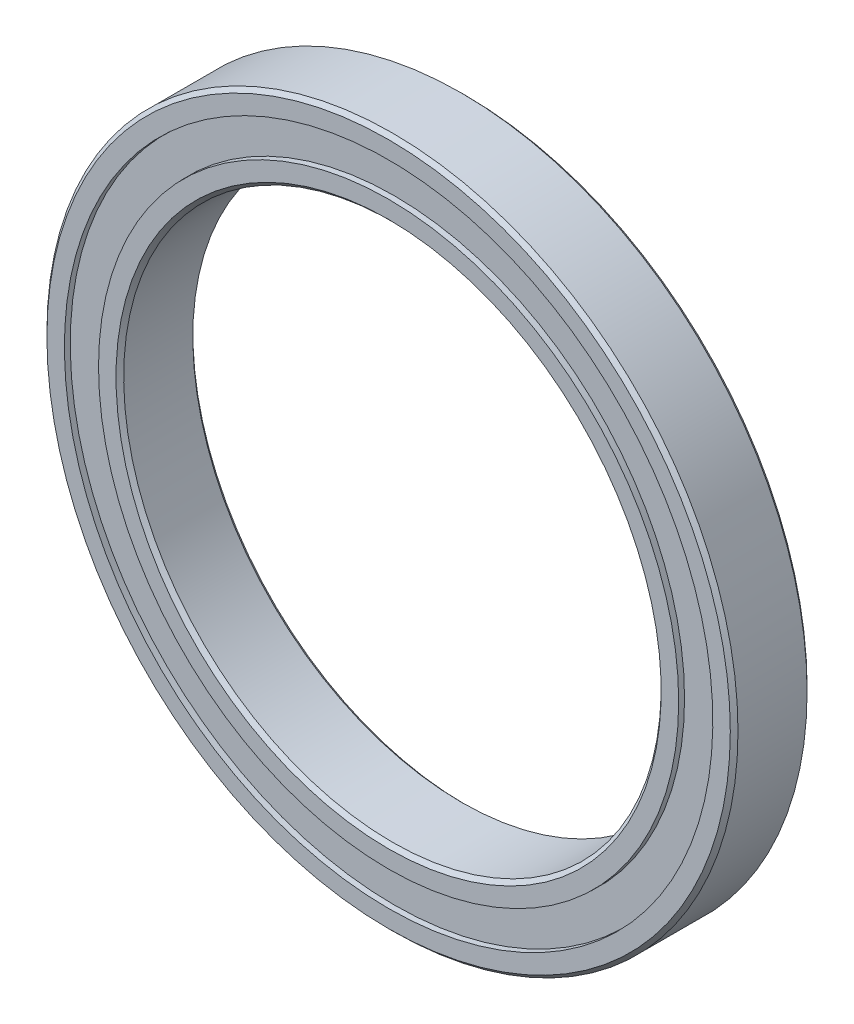
ISO-10303-21;
HEADER;
FILE_DESCRIPTION(('STEP AP214'),'2;1');
FILE_NAME('part.step','',(''),(''),'','','');
FILE_SCHEMA(('AUTOMOTIVE_DESIGN { 1 0 10303 214 1 1 1 1 }'));
ENDSEC;
DATA;
#1=APPLICATION_CONTEXT('core data for automotive mechanical design processes');
#2=APPLICATION_PROTOCOL_DEFINITION('international standard','automotive_design',2000,#1);
#3=PRODUCT_CONTEXT('',#1,'mechanical');
#4=PRODUCT('Part','Part','',(#3));
#5=PRODUCT_RELATED_PRODUCT_CATEGORY('part','',(#4));
#6=PRODUCT_DEFINITION_FORMATION('','',#4);
#7=PRODUCT_DEFINITION_CONTEXT('part definition',#1,'design');
#8=PRODUCT_DEFINITION('design','',#6,#7);
#9=PRODUCT_DEFINITION_SHAPE('','',#8);
#10=(LENGTH_UNIT() NAMED_UNIT(*) SI_UNIT(.MILLI.,.METRE.));
#11=(NAMED_UNIT(*) PLANE_ANGLE_UNIT() SI_UNIT($,.RADIAN.));
#12=(NAMED_UNIT(*) SI_UNIT($,.STERADIAN.) SOLID_ANGLE_UNIT());
#13=UNCERTAINTY_MEASURE_WITH_UNIT(LENGTH_MEASURE(1.E-05),#10,'distance_accuracy_value','');
#14=(GEOMETRIC_REPRESENTATION_CONTEXT(3) GLOBAL_UNCERTAINTY_ASSIGNED_CONTEXT((#13)) GLOBAL_UNIT_ASSIGNED_CONTEXT((#10,
#11,#12)) REPRESENTATION_CONTEXT('',''));
#15=CARTESIAN_POINT('',(0.,0.,0.));
#16=DIRECTION('',(0.,0.,1.));
#17=DIRECTION('',(1.,0.,0.));
#18=AXIS2_PLACEMENT_3D('',#15,#16,#17);
#19=CARTESIAN_POINT('',(10.3527618041003,38.6370330515629,0.));
#20=DIRECTION('',(0.,0.,1.));
#21=DIRECTION('',(0.258819045102508,0.965925826289072,0.));
#22=AXIS2_PLACEMENT_3D('',#19,#20,#21);
#23=SPHERICAL_SURFACE('',#22,3.14269680527354);
#24=CARTESIAN_POINT('',(10.3527618041003,38.6370330515629,3.14269680527354));
#25=VERTEX_POINT('',#24);
#26=VERTEX_LOOP('',#25);
#27=FACE_BOUND('',#26,.T.);
#28=ADVANCED_FACE('F46',(#27),#23,.T.);
#29=CLOSED_SHELL('',(#28));
#30=MANIFOLD_SOLID_BREP('B2',#29);
#31=CARTESIAN_POINT('',(19.9999999999996,34.6410161513778,0.));
#32=DIRECTION('',(0.,0.,1.));
#33=DIRECTION('',(0.499999999999989,0.866025403784445,0.));
#34=AXIS2_PLACEMENT_3D('',#31,#32,#33);
#35=SPHERICAL_SURFACE('',#34,3.14269680527354);
#36=CARTESIAN_POINT('',(19.9999999999996,34.6410161513778,3.14269680527354));
#37=VERTEX_POINT('',#36);
#38=VERTEX_LOOP('',#37);
#39=FACE_BOUND('',#38,.T.);
#40=ADVANCED_FACE('F63',(#39),#35,.T.);
#41=CLOSED_SHELL('',(#40));
#42=MANIFOLD_SOLID_BREP('B6',#41);
#43=CARTESIAN_POINT('',(28.2842712474616,28.2842712474623,0.));
#44=DIRECTION('',(0.,0.,1.));
#45=DIRECTION('',(0.707106781186539,0.707106781186556,0.));
#46=AXIS2_PLACEMENT_3D('',#43,#44,#45);
#47=SPHERICAL_SURFACE('',#46,3.14269680527354);
#48=CARTESIAN_POINT('',(28.2842712474616,28.2842712474623,3.14269680527354));
#49=VERTEX_POINT('',#48);
#50=VERTEX_LOOP('',#49);
#51=FACE_BOUND('',#50,.T.);
#52=ADVANCED_FACE('F81',(#51),#47,.T.);
#53=CLOSED_SHELL('',(#52));
#54=MANIFOLD_SOLID_BREP('B45',#53);
#55=CARTESIAN_POINT('',(34.6410161513773,20.0000000000004,0.));
#56=DIRECTION('',(0.,0.,1.));
#57=DIRECTION('',(0.866025403784433,0.50000000000001,0.));
#58=AXIS2_PLACEMENT_3D('',#55,#56,#57);
#59=SPHERICAL_SURFACE('',#58,3.14269680527354);
#60=CARTESIAN_POINT('',(34.6410161513773,20.0000000000004,3.14269680527354));
#61=VERTEX_POINT('',#60);
#62=VERTEX_LOOP('',#61);
#63=FACE_BOUND('',#62,.T.);
#64=ADVANCED_FACE('F101',(#63),#59,.T.);
#65=CLOSED_SHELL('',(#64));
#66=MANIFOLD_SOLID_BREP('B62',#65);
#67=CARTESIAN_POINT('',(38.6370330515626,10.3527618041013,0.));
#68=DIRECTION('',(0.,0.,1.));
#69=DIRECTION('',(0.965925826289065,0.258819045102531,0.));
#70=AXIS2_PLACEMENT_3D('',#67,#68,#69);
#71=SPHERICAL_SURFACE('',#70,3.14269680527354);
#72=CARTESIAN_POINT('',(38.6370330515626,10.3527618041013,3.14269680527354));
#73=VERTEX_POINT('',#72);
#74=VERTEX_LOOP('',#73);
#75=FACE_BOUND('',#74,.T.);
#76=ADVANCED_FACE('F125',(#75),#71,.T.);
#77=CLOSED_SHELL('',(#76));
#78=MANIFOLD_SOLID_BREP('B78',#77);
#79=CARTESIAN_POINT('',(40.,4.18977760661176E-13,0.));
#80=DIRECTION('',(0.,0.,1.));
#81=DIRECTION('',(1.,0.,0.));
#82=AXIS2_PLACEMENT_3D('',#79,#80,#81);
#83=SPHERICAL_SURFACE('',#82,3.14269680527354);
#84=CARTESIAN_POINT('',(40.,4.18592891302849E-13,3.14269680527354));
#85=VERTEX_POINT('',#84);
#86=VERTEX_LOOP('',#85);
#87=FACE_BOUND('',#86,.T.);
#88=ADVANCED_FACE('F142',(#87),#83,.T.);
#89=CLOSED_SHELL('',(#88));
#90=MANIFOLD_SOLID_BREP('B100',#89);
#91=CARTESIAN_POINT('',(38.6370330515628,-10.3527618041004,0.));
#92=DIRECTION('',(0.,0.,1.));
#93=DIRECTION('',(0.965925826289071,-0.258819045102511,0.));
#94=AXIS2_PLACEMENT_3D('',#91,#92,#93);
#95=SPHERICAL_SURFACE('',#94,3.14269680527354);
#96=CARTESIAN_POINT('',(38.6370330515628,-10.3527618041004,3.14269680527354));
#97=VERTEX_POINT('',#96);
#98=VERTEX_LOOP('',#97);
#99=FACE_BOUND('',#98,.T.);
#100=ADVANCED_FACE('F158',(#99),#95,.T.);
#101=CLOSED_SHELL('',(#100));
#102=MANIFOLD_SOLID_BREP('B117',#101);
#103=CARTESIAN_POINT('',(34.6410161513777,-19.9999999999997,0.));
#104=DIRECTION('',(0.,0.,1.));
#105=DIRECTION('',(0.866025403784443,-0.499999999999992,0.));
#106=AXIS2_PLACEMENT_3D('',#103,#104,#105);
#107=SPHERICAL_SURFACE('',#106,3.14269680527354);
#108=CARTESIAN_POINT('',(34.6410161513777,-19.9999999999997,3.14269680527354));
#109=VERTEX_POINT('',#108);
#110=VERTEX_LOOP('',#109);
#111=FACE_BOUND('',#110,.T.);
#112=ADVANCED_FACE('F181',(#111),#107,.T.);
#113=CLOSED_SHELL('',(#112));
#114=MANIFOLD_SOLID_BREP('B140',#113);
#115=CARTESIAN_POINT('',(28.2842712474622,-28.2842712474617,0.));
#116=DIRECTION('',(0.,0.,1.));
#117=DIRECTION('',(0.707106781186554,-0.707106781186541,0.));
#118=AXIS2_PLACEMENT_3D('',#115,#116,#117);
#119=SPHERICAL_SURFACE('',#118,3.14269680527354);
#120=CARTESIAN_POINT('',(28.2842712474622,-28.2842712474617,3.14269680527353));
#121=VERTEX_POINT('',#120);
#122=VERTEX_LOOP('',#121);
#123=FACE_BOUND('',#122,.T.);
#124=ADVANCED_FACE('F205',(#123),#119,.T.);
#125=CLOSED_SHELL('',(#124));
#126=MANIFOLD_SOLID_BREP('B157',#125);
#127=CARTESIAN_POINT('',(20.0000000000003,-34.6410161513774,0.));
#128=DIRECTION('',(0.,0.,1.));
#129=DIRECTION('',(0.500000000000007,-0.866025403784435,0.));
#130=AXIS2_PLACEMENT_3D('',#127,#128,#129);
#131=SPHERICAL_SURFACE('',#130,3.14269680527354);
#132=CARTESIAN_POINT('',(20.0000000000003,-34.6410161513774,3.14269680527353));
#133=VERTEX_POINT('',#132);
#134=VERTEX_LOOP('',#133);
#135=FACE_BOUND('',#134,.T.);
#136=ADVANCED_FACE('F225',(#135),#131,.T.);
#137=CLOSED_SHELL('',(#136));
#138=MANIFOLD_SOLID_BREP('B180',#137);
#139=CARTESIAN_POINT('',(10.3527618041011,-38.6370330515627,0.));
#140=DIRECTION('',(0.,0.,1.));
#141=DIRECTION('',(0.258819045102528,-0.965925826289066,0.));
#142=AXIS2_PLACEMENT_3D('',#139,#140,#141);
#143=SPHERICAL_SURFACE('',#142,3.14269680527354);
#144=CARTESIAN_POINT('',(10.3527618041011,-38.6370330515627,3.14269680527353));
#145=VERTEX_POINT('',#144);
#146=VERTEX_LOOP('',#145);
#147=FACE_BOUND('',#146,.T.);
#148=ADVANCED_FACE('F242',(#147),#143,.T.);
#149=CLOSED_SHELL('',(#148));
#150=MANIFOLD_SOLID_BREP('B197',#149);
#151=CARTESIAN_POINT('',(2.79318507107451E-13,-40.,0.));
#152=DIRECTION('',(0.,0.,1.));
#153=DIRECTION('',(0.,-1.,0.));
#154=AXIS2_PLACEMENT_3D('',#151,#152,#153);
#155=SPHERICAL_SURFACE('',#154,3.14269680527354);
#156=CARTESIAN_POINT('',(2.79318507107451E-13,-40.,3.14269680527353));
#157=VERTEX_POINT('',#156);
#158=VERTEX_LOOP('',#157);
#159=FACE_BOUND('',#158,.T.);
#160=ADVANCED_FACE('F261',(#159),#155,.T.);
#161=CLOSED_SHELL('',(#160));
#162=MANIFOLD_SOLID_BREP('B220',#161);
#163=CARTESIAN_POINT('',(-10.3527618041006,-38.6370330515628,0.));
#164=DIRECTION('',(0.,0.,1.));
#165=DIRECTION('',(-0.258819045102515,-0.96592582628907,0.));
#166=AXIS2_PLACEMENT_3D('',#163,#164,#165);
#167=SPHERICAL_SURFACE('',#166,3.14269680527354);
#168=CARTESIAN_POINT('',(-10.3527618041006,-38.6370330515628,3.14269680527353));
#169=VERTEX_POINT('',#168);
#170=VERTEX_LOOP('',#169);
#171=FACE_BOUND('',#170,.T.);
#172=ADVANCED_FACE('F287',(#171),#167,.T.);
#173=CLOSED_SHELL('',(#172));
#174=MANIFOLD_SOLID_BREP('B239',#173);
#175=CARTESIAN_POINT('',(-19.9999999999998,-34.6410161513777,0.));
#176=DIRECTION('',(0.,0.,1.));
#177=DIRECTION('',(-0.499999999999995,-0.866025403784442,0.));
#178=AXIS2_PLACEMENT_3D('',#175,#176,#177);
#179=SPHERICAL_SURFACE('',#178,3.14269680527354);
#180=CARTESIAN_POINT('',(-19.9999999999998,-34.6410161513777,3.14269680527353));
#181=VERTEX_POINT('',#180);
#182=VERTEX_LOOP('',#181);
#183=FACE_BOUND('',#182,.T.);
#184=ADVANCED_FACE('F310',(#183),#179,.T.);
#185=CLOSED_SHELL('',(#184));
#186=MANIFOLD_SOLID_BREP('B263',#185);
#187=CARTESIAN_POINT('',(-28.2842712474618,-28.2842712474621,0.));
#188=DIRECTION('',(0.,0.,1.));
#189=DIRECTION('',(-0.707106781186544,-0.707106781186551,0.));
#190=AXIS2_PLACEMENT_3D('',#187,#188,#189);
#191=SPHERICAL_SURFACE('',#190,3.14269680527354);
#192=CARTESIAN_POINT('',(-28.2842712474618,-28.2842712474621,3.14269680527353));
#193=VERTEX_POINT('',#192);
#194=VERTEX_LOOP('',#193);
#195=FACE_BOUND('',#194,.T.);
#196=ADVANCED_FACE('F327',(#195),#191,.T.);
#197=CLOSED_SHELL('',(#196));
#198=MANIFOLD_SOLID_BREP('B284',#197);
#199=CARTESIAN_POINT('',(-34.6410161513775,-20.0000000000002,0.));
#200=DIRECTION('',(0.,0.,1.));
#201=DIRECTION('',(-0.866025403784436,-0.500000000000004,0.));
#202=AXIS2_PLACEMENT_3D('',#199,#200,#201);
#203=SPHERICAL_SURFACE('',#202,3.14269680527354);
#204=CARTESIAN_POINT('',(-34.6410161513775,-20.0000000000002,3.14269680527354));
#205=VERTEX_POINT('',#204);
#206=VERTEX_LOOP('',#205);
#207=FACE_BOUND('',#206,.T.);
#208=ADVANCED_FACE('F350',(#207),#203,.T.);
#209=CLOSED_SHELL('',(#208));
#210=MANIFOLD_SOLID_BREP('B303',#209);
#211=CARTESIAN_POINT('',(-38.6370330515627,-10.352761804101,0.));
#212=DIRECTION('',(0.,0.,1.));
#213=DIRECTION('',(-0.965925826289067,-0.258819045102525,0.));
#214=AXIS2_PLACEMENT_3D('',#211,#212,#213);
#215=SPHERICAL_SURFACE('',#214,3.14269680527354);
#216=CARTESIAN_POINT('',(-38.6370330515627,-10.352761804101,3.14269680527354));
#217=VERTEX_POINT('',#216);
#218=VERTEX_LOOP('',#217);
#219=FACE_BOUND('',#218,.T.);
#220=ADVANCED_FACE('F369',(#219),#215,.T.);
#221=CLOSED_SHELL('',(#220));
#222=MANIFOLD_SOLID_BREP('B321',#221);
#223=CARTESIAN_POINT('',(-40.,-1.39659253553725E-13,0.));
#224=DIRECTION('',(0.,0.,1.));
#225=DIRECTION('',(-1.,0.,0.));
#226=AXIS2_PLACEMENT_3D('',#223,#224,#225);
#227=SPHERICAL_SURFACE('',#226,3.14269680527354);
#228=CARTESIAN_POINT('',(-40.,-1.40044122912052E-13,3.14269680527354));
#229=VERTEX_POINT('',#228);
#230=VERTEX_LOOP('',#229);
#231=FACE_BOUND('',#230,.T.);
#232=ADVANCED_FACE('F393',(#231),#227,.T.);
#233=CLOSED_SHELL('',(#232));
#234=MANIFOLD_SOLID_BREP('B343',#233);
#235=CARTESIAN_POINT('',(-38.6370330515628,10.3527618041007,0.));
#236=DIRECTION('',(0.,0.,1.));
#237=DIRECTION('',(-0.965925826289069,0.258819045102518,0.));
#238=AXIS2_PLACEMENT_3D('',#235,#236,#237);
#239=SPHERICAL_SURFACE('',#238,3.14269680527354);
#240=CARTESIAN_POINT('',(-38.6370330515628,10.3527618041007,3.14269680527354));
#241=VERTEX_POINT('',#240);
#242=VERTEX_LOOP('',#241);
#243=FACE_BOUND('',#242,.T.);
#244=ADVANCED_FACE('F414',(#243),#239,.T.);
#245=CLOSED_SHELL('',(#244));
#246=MANIFOLD_SOLID_BREP('B366',#245);
#247=CARTESIAN_POINT('',(-34.6410161513776,19.9999999999999,0.));
#248=DIRECTION('',(0.,0.,1.));
#249=DIRECTION('',(-0.86602540378444,0.499999999999998,0.));
#250=AXIS2_PLACEMENT_3D('',#247,#248,#249);
#251=SPHERICAL_SURFACE('',#250,3.14269680527354);
#252=CARTESIAN_POINT('',(-34.6410161513776,19.9999999999999,3.14269680527354));
#253=VERTEX_POINT('',#252);
#254=VERTEX_LOOP('',#253);
#255=FACE_BOUND('',#254,.T.);
#256=ADVANCED_FACE('F433',(#255),#251,.T.);
#257=CLOSED_SHELL('',(#256));
#258=MANIFOLD_SOLID_BREP('B390',#257);
#259=CARTESIAN_POINT('',(-28.284271247462,28.2842712474619,0.));
#260=DIRECTION('',(0.,0.,1.));
#261=DIRECTION('',(-0.707106781186549,0.707106781186546,0.));
#262=AXIS2_PLACEMENT_3D('',#259,#260,#261);
#263=SPHERICAL_SURFACE('',#262,3.14269680527354);
#264=CARTESIAN_POINT('',(-28.284271247462,28.2842712474619,3.14269680527354));
#265=VERTEX_POINT('',#264);
#266=VERTEX_LOOP('',#265);
#267=FACE_BOUND('',#266,.T.);
#268=ADVANCED_FACE('F451',(#267),#263,.T.);
#269=CLOSED_SHELL('',(#268));
#270=MANIFOLD_SOLID_BREP('B409',#269);
#271=CARTESIAN_POINT('',(-20.,34.6410161513775,0.));
#272=DIRECTION('',(0.,0.,1.));
#273=DIRECTION('',(-0.500000000000001,0.866025403784438,0.));
#274=AXIS2_PLACEMENT_3D('',#271,#272,#273);
#275=SPHERICAL_SURFACE('',#274,3.14269680527354);
#276=CARTESIAN_POINT('',(-20.,34.6410161513775,3.14269680527354));
#277=VERTEX_POINT('',#276);
#278=VERTEX_LOOP('',#277);
#279=FACE_BOUND('',#278,.T.);
#280=ADVANCED_FACE('F473',(#279),#275,.T.);
#281=CLOSED_SHELL('',(#280));
#282=MANIFOLD_SOLID_BREP('B429',#281);
#283=CARTESIAN_POINT('',(-10.3527618041009,38.6370330515627,0.));
#284=DIRECTION('',(0.,0.,1.));
#285=DIRECTION('',(-0.258819045102521,0.965925826289068,0.));
#286=AXIS2_PLACEMENT_3D('',#283,#284,#285);
#287=SPHERICAL_SURFACE('',#286,3.14269680527354);
#288=CARTESIAN_POINT('',(-10.3527618041009,38.6370330515627,3.14269680527354));
#289=VERTEX_POINT('',#288);
#290=VERTEX_LOOP('',#289);
#291=FACE_BOUND('',#290,.T.);
#292=ADVANCED_FACE('F496',(#291),#287,.T.);
#293=CLOSED_SHELL('',(#292));
#294=MANIFOLD_SOLID_BREP('B448',#293);
#295=CARTESIAN_POINT('',(0.,40.,0.));
#296=DIRECTION('',(0.,0.,1.));
#297=DIRECTION('',(0.,1.,0.));
#298=AXIS2_PLACEMENT_3D('',#295,#296,#297);
#299=SPHERICAL_SURFACE('',#298,3.14269680527354);
#300=CARTESIAN_POINT('',(0.,40.,3.14269680527354));
#301=VERTEX_POINT('',#300);
#302=VERTEX_LOOP('',#301);
#303=FACE_BOUND('',#302,.T.);
#304=ADVANCED_FACE('F516',(#303),#299,.T.);
#305=CLOSED_SHELL('',(#304));
#306=MANIFOLD_SOLID_BREP('B472',#305);
#307=CARTESIAN_POINT('',(0.,37.7777777777778,5.00000000000002));
#308=DIRECTION('',(0.,0.,-1.));
#309=DIRECTION('',(0.,1.,0.));
#310=AXIS2_PLACEMENT_3D('',#307,#308,#309);
#311=PLANE('',#310);
#312=CARTESIAN_POINT('',(0.,0.,5.00000000000002));
#313=DIRECTION('',(0.,0.,1.));
#314=DIRECTION('',(0.,-1.,0.));
#315=AXIS2_PLACEMENT_3D('',#312,#313,#314);
#316=CIRCLE('',#315,35.5);
#317=CARTESIAN_POINT('',(0.,-35.5,5.00000000000002));
#318=VERTEX_POINT('',#317);
#319=EDGE_CURVE('E580',#318,#318,#316,.T.);
#320=ORIENTED_EDGE('',*,*,#319,.F.);
#321=EDGE_LOOP('',(#320));
#322=FACE_BOUND('',#321,.T.);
#323=CARTESIAN_POINT('',(0.,0.,5.00000000000002));
#324=DIRECTION('',(0.,0.,1.));
#325=DIRECTION('',(0.,-1.,0.));
#326=AXIS2_PLACEMENT_3D('',#323,#324,#325);
#327=CIRCLE('',#326,37.7777777777778);
#328=CARTESIAN_POINT('',(0.,-37.7777777777778,5.00000000000002));
#329=VERTEX_POINT('',#328);
#330=EDGE_CURVE('E519',#329,#329,#327,.T.);
#331=ORIENTED_EDGE('',*,*,#330,.T.);
#332=EDGE_LOOP('',(#331));
#333=FACE_BOUND('',#332,.T.);
#334=ADVANCED_FACE('F538',(#322,#333),#311,.F.);
#335=CARTESIAN_POINT('',(0.,0.,5.00000000000002));
#336=DIRECTION('',(0.,0.,1.));
#337=DIRECTION('',(0.,-1.,0.));
#338=AXIS2_PLACEMENT_3D('',#335,#336,#337);
#339=CYLINDRICAL_SURFACE('',#338,37.7777777777778);
#340=ORIENTED_EDGE('',*,*,#330,.F.);
#341=EDGE_LOOP('',(#340));
#342=FACE_BOUND('',#341,.T.);
#343=CARTESIAN_POINT('',(0.,0.,2.22222222222222));
#344=DIRECTION('',(0.,0.,1.));
#345=DIRECTION('',(0.,-1.,0.));
#346=AXIS2_PLACEMENT_3D('',#343,#344,#345);
#347=CIRCLE('',#346,37.7777777777778);
#348=CARTESIAN_POINT('',(0.,-37.7777777777778,2.22222222222221));
#349=VERTEX_POINT('',#348);
#350=EDGE_CURVE('E549',#349,#349,#347,.T.);
#351=ORIENTED_EDGE('',*,*,#350,.T.);
#352=EDGE_LOOP('',(#351));
#353=FACE_BOUND('',#352,.T.);
#354=ADVANCED_FACE('F588',(#342,#353),#339,.T.);
#355=CARTESIAN_POINT('',(0.,0.,0.));
#356=DIRECTION('',(0.,0.,1.));
#357=DIRECTION('',(0.,-1.,0.));
#358=AXIS2_PLACEMENT_3D('',#355,#356,#357);
#359=TOROIDAL_SURFACE('',#358,40.,3.14269680527354);
#360=ORIENTED_EDGE('',*,*,#350,.F.);
#361=EDGE_LOOP('',(#360));
#362=FACE_BOUND('',#361,.T.);
#363=CARTESIAN_POINT('',(0.,0.,-2.22222222222223));
#364=DIRECTION('',(0.,0.,1.));
#365=DIRECTION('',(0.,-1.,0.));
#366=AXIS2_PLACEMENT_3D('',#363,#364,#365);
#367=CIRCLE('',#366,37.7777777777778);
#368=CARTESIAN_POINT('',(0.,-37.7777777777778,-2.22222222222223));
#369=VERTEX_POINT('',#368);
#370=EDGE_CURVE('E551',#369,#369,#367,.T.);
#371=ORIENTED_EDGE('',*,*,#370,.T.);
#372=EDGE_LOOP('',(#371));
#373=FACE_BOUND('',#372,.T.);
#374=ADVANCED_FACE('F586',(#362,#373),#359,.F.);
#375=CARTESIAN_POINT('',(0.,0.,5.00000000000002));
#376=DIRECTION('',(0.,0.,1.));
#377=DIRECTION('',(0.,-1.,0.));
#378=AXIS2_PLACEMENT_3D('',#375,#376,#377);
#379=CYLINDRICAL_SURFACE('',#378,37.7777777777778);
#380=ORIENTED_EDGE('',*,*,#370,.F.);
#381=EDGE_LOOP('',(#380));
#382=FACE_BOUND('',#381,.T.);
#383=CARTESIAN_POINT('',(0.,0.,-5.00000000000003));
#384=DIRECTION('',(0.,0.,1.));
#385=DIRECTION('',(0.,-1.,0.));
#386=AXIS2_PLACEMENT_3D('',#383,#384,#385);
#387=CIRCLE('',#386,37.7777777777778);
#388=CARTESIAN_POINT('',(0.,-37.7777777777778,-5.00000000000003));
#389=VERTEX_POINT('',#388);
#390=EDGE_CURVE('E559',#389,#389,#387,.T.);
#391=ORIENTED_EDGE('',*,*,#390,.T.);
#392=EDGE_LOOP('',(#391));
#393=FACE_BOUND('',#392,.T.);
#394=ADVANCED_FACE('F594',(#382,#393),#379,.T.);
#395=CARTESIAN_POINT('',(0.,35.5,-5.00000000000003));
#396=DIRECTION('',(0.,0.,1.));
#397=DIRECTION('',(0.,-1.,0.));
#398=AXIS2_PLACEMENT_3D('',#395,#396,#397);
#399=PLANE('',#398);
#400=ORIENTED_EDGE('',*,*,#390,.F.);
#401=EDGE_LOOP('',(#400));
#402=FACE_BOUND('',#401,.T.);
#403=CARTESIAN_POINT('',(0.,0.,-5.00000000000003));
#404=DIRECTION('',(0.,0.,1.));
#405=DIRECTION('',(0.,-1.,0.));
#406=AXIS2_PLACEMENT_3D('',#403,#404,#405);
#407=CIRCLE('',#406,35.5);
#408=CARTESIAN_POINT('',(0.,-35.5,-5.00000000000004));
#409=VERTEX_POINT('',#408);
#410=EDGE_CURVE('E564',#409,#409,#407,.T.);
#411=ORIENTED_EDGE('',*,*,#410,.T.);
#412=EDGE_LOOP('',(#411));
#413=FACE_BOUND('',#412,.T.);
#414=ADVANCED_FACE('F602',(#402,#413),#399,.F.);
#415=CARTESIAN_POINT('',(0.,0.,-4.50000000000002));
#416=DIRECTION('',(0.,0.,-1.));
#417=DIRECTION('',(0.,1.,0.));
#418=AXIS2_PLACEMENT_3D('',#415,#416,#417);
#419=CONICAL_SURFACE('',#418,35.,0.785398163397433);
#420=ORIENTED_EDGE('',*,*,#410,.F.);
#421=EDGE_LOOP('',(#420));
#422=FACE_BOUND('',#421,.T.);
#423=CARTESIAN_POINT('',(0.,0.,-4.50000000000002));
#424=DIRECTION('',(0.,0.,1.));
#425=DIRECTION('',(0.,-1.,0.));
#426=AXIS2_PLACEMENT_3D('',#423,#424,#425);
#427=CIRCLE('',#426,35.);
#428=CARTESIAN_POINT('',(0.,-35.,-4.50000000000003));
#429=VERTEX_POINT('',#428);
#430=EDGE_CURVE('E567',#429,#429,#427,.T.);
#431=ORIENTED_EDGE('',*,*,#430,.T.);
#432=EDGE_LOOP('',(#431));
#433=FACE_BOUND('',#432,.T.);
#434=ADVANCED_FACE('F603',(#422,#433),#419,.F.);
#435=CARTESIAN_POINT('',(0.,0.,5.00000000000002));
#436=DIRECTION('',(0.,0.,1.));
#437=DIRECTION('',(0.,-1.,0.));
#438=AXIS2_PLACEMENT_3D('',#435,#436,#437);
#439=CYLINDRICAL_SURFACE('',#438,35.);
#440=ORIENTED_EDGE('',*,*,#430,.F.);
#441=EDGE_LOOP('',(#440));
#442=FACE_BOUND('',#441,.T.);
#443=CARTESIAN_POINT('',(0.,0.,4.50000000000003));
#444=DIRECTION('',(0.,0.,1.));
#445=DIRECTION('',(0.,-1.,0.));
#446=AXIS2_PLACEMENT_3D('',#443,#444,#445);
#447=CIRCLE('',#446,35.);
#448=CARTESIAN_POINT('',(0.,-35.,4.50000000000002));
#449=VERTEX_POINT('',#448);
#450=EDGE_CURVE('E572',#449,#449,#447,.T.);
#451=ORIENTED_EDGE('',*,*,#450,.T.);
#452=EDGE_LOOP('',(#451));
#453=FACE_BOUND('',#452,.T.);
#454=ADVANCED_FACE('F610',(#442,#453),#439,.F.);
#455=CARTESIAN_POINT('',(0.,0.,5.00000000000002));
#456=DIRECTION('',(0.,0.,1.));
#457=DIRECTION('',(0.,-1.,0.));
#458=AXIS2_PLACEMENT_3D('',#455,#456,#457);
#459=CONICAL_SURFACE('',#458,35.5,0.785398163397463);
#460=ORIENTED_EDGE('',*,*,#450,.F.);
#461=EDGE_LOOP('',(#460));
#462=FACE_BOUND('',#461,.T.);
#463=ORIENTED_EDGE('',*,*,#319,.T.);
#464=EDGE_LOOP('',(#463));
#465=FACE_BOUND('',#464,.T.);
#466=ADVANCED_FACE('F584',(#462,#465),#459,.F.);
#467=CLOSED_SHELL('',(#334,#354,#374,#394,#414,#434,#454,#466));
#468=MANIFOLD_SOLID_BREP('B495',#467);
#469=CARTESIAN_POINT('',(0.,37.8031777777778,-3.88084840263679));
#470=DIRECTION('',(0.,0.,-1.));
#471=DIRECTION('',(0.,1.,0.));
#472=AXIS2_PLACEMENT_3D('',#469,#470,#471);
#473=PLANE('',#472);
#474=CARTESIAN_POINT('',(0.,0.,-3.88084840263679));
#475=DIRECTION('',(0.,0.,1.));
#476=DIRECTION('',(0.,-1.,0.));
#477=AXIS2_PLACEMENT_3D('',#474,#475,#476);
#478=CIRCLE('',#477,37.8031777777778);
#479=CARTESIAN_POINT('',(0.,-37.8031777777778,-3.8808484026368));
#480=VERTEX_POINT('',#479);
#481=EDGE_CURVE('E704',#480,#480,#478,.T.);
#482=ORIENTED_EDGE('',*,*,#481,.F.);
#483=EDGE_LOOP('',(#482));
#484=FACE_BOUND('',#483,.T.);
#485=CARTESIAN_POINT('',(0.,0.,-3.88084840263679));
#486=DIRECTION('',(0.,0.,1.));
#487=DIRECTION('',(0.,-1.,0.));
#488=AXIS2_PLACEMENT_3D('',#485,#486,#487);
#489=CIRCLE('',#488,42.1968222222222);
#490=CARTESIAN_POINT('',(0.,-42.1968222222222,-3.8808484026368));
#491=VERTEX_POINT('',#490);
#492=EDGE_CURVE('E536',#491,#491,#489,.T.);
#493=ORIENTED_EDGE('',*,*,#492,.T.);
#494=EDGE_LOOP('',(#493));
#495=FACE_BOUND('',#494,.T.);
#496=ADVANCED_FACE('F688',(#484,#495),#473,.F.);
#497=CARTESIAN_POINT('',(0.,0.,5.00000000000002));
#498=DIRECTION('',(0.,0.,1.));
#499=DIRECTION('',(0.,-1.,0.));
#500=AXIS2_PLACEMENT_3D('',#497,#498,#499);
#501=CYLINDRICAL_SURFACE('',#500,42.1968222222222);
#502=ORIENTED_EDGE('',*,*,#492,.F.);
#503=EDGE_LOOP('',(#502));
#504=FACE_BOUND('',#503,.T.);
#505=CARTESIAN_POINT('',(0.,0.,-4.26184840263679));
#506=DIRECTION('',(0.,0.,1.));
#507=DIRECTION('',(0.,-1.,0.));
#508=AXIS2_PLACEMENT_3D('',#505,#506,#507);
#509=CIRCLE('',#508,42.1968222222222);
#510=CARTESIAN_POINT('',(0.,-42.1968222222222,-4.2618484026368));
#511=VERTEX_POINT('',#510);
#512=EDGE_CURVE('E693',#511,#511,#509,.T.);
#513=ORIENTED_EDGE('',*,*,#512,.T.);
#514=EDGE_LOOP('',(#513));
#515=FACE_BOUND('',#514,.T.);
#516=ADVANCED_FACE('F718',(#504,#515),#501,.T.);
#517=CARTESIAN_POINT('',(0.,37.8031777777778,-4.26184840263679));
#518=DIRECTION('',(0.,0.,1.));
#519=DIRECTION('',(0.,-1.,0.));
#520=AXIS2_PLACEMENT_3D('',#517,#518,#519);
#521=PLANE('',#520);
#522=ORIENTED_EDGE('',*,*,#512,.F.);
#523=EDGE_LOOP('',(#522));
#524=FACE_BOUND('',#523,.T.);
#525=CARTESIAN_POINT('',(0.,0.,-4.26184840263679));
#526=DIRECTION('',(0.,0.,1.));
#527=DIRECTION('',(0.,-1.,0.));
#528=AXIS2_PLACEMENT_3D('',#525,#526,#527);
#529=CIRCLE('',#528,37.8031777777778);
#530=CARTESIAN_POINT('',(0.,-37.8031777777778,-4.2618484026368));
#531=VERTEX_POINT('',#530);
#532=EDGE_CURVE('E697',#531,#531,#529,.T.);
#533=ORIENTED_EDGE('',*,*,#532,.T.);
#534=EDGE_LOOP('',(#533));
#535=FACE_BOUND('',#534,.T.);
#536=ADVANCED_FACE('F716',(#524,#535),#521,.F.);
#537=CARTESIAN_POINT('',(0.,0.,5.00000000000002));
#538=DIRECTION('',(0.,0.,1.));
#539=DIRECTION('',(0.,-1.,0.));
#540=AXIS2_PLACEMENT_3D('',#537,#538,#539);
#541=CYLINDRICAL_SURFACE('',#540,37.8031777777778);
#542=ORIENTED_EDGE('',*,*,#532,.F.);
#543=EDGE_LOOP('',(#542));
#544=FACE_BOUND('',#543,.T.);
#545=ORIENTED_EDGE('',*,*,#481,.T.);
#546=EDGE_LOOP('',(#545));
#547=FACE_BOUND('',#546,.T.);
#548=ADVANCED_FACE('F714',(#544,#547),#541,.F.);
#549=CLOSED_SHELL('',(#496,#516,#536,#548));
#550=MANIFOLD_SOLID_BREP('B514',#549);
#551=CARTESIAN_POINT('',(0.,37.8031777777778,4.26184840263678));
#552=DIRECTION('',(0.,0.,-1.));
#553=DIRECTION('',(0.,1.,0.));
#554=AXIS2_PLACEMENT_3D('',#551,#552,#553);
#555=PLANE('',#554);
#556=CARTESIAN_POINT('',(0.,0.,4.26184840263678));
#557=DIRECTION('',(0.,0.,1.));
#558=DIRECTION('',(0.,-1.,0.));
#559=AXIS2_PLACEMENT_3D('',#556,#557,#558);
#560=CIRCLE('',#559,37.8031777777778);
#561=CARTESIAN_POINT('',(0.,-37.8031777777778,4.26184840263677));
#562=VERTEX_POINT('',#561);
#563=EDGE_CURVE('E684',#562,#562,#560,.T.);
#564=ORIENTED_EDGE('',*,*,#563,.F.);
#565=EDGE_LOOP('',(#564));
#566=FACE_BOUND('',#565,.T.);
#567=CARTESIAN_POINT('',(0.,0.,4.26184840263678));
#568=DIRECTION('',(0.,0.,1.));
#569=DIRECTION('',(0.,-1.,0.));
#570=AXIS2_PLACEMENT_3D('',#567,#568,#569);
#571=CIRCLE('',#570,42.1968222222222);
#572=CARTESIAN_POINT('',(0.,-42.1968222222222,4.26184840263677));
#573=VERTEX_POINT('',#572);
#574=EDGE_CURVE('E784',#573,#573,#571,.T.);
#575=ORIENTED_EDGE('',*,*,#574,.T.);
#576=EDGE_LOOP('',(#575));
#577=FACE_BOUND('',#576,.T.);
#578=ADVANCED_FACE('F763',(#566,#577),#555,.F.);
#579=CARTESIAN_POINT('',(0.,0.,5.00000000000002));
#580=DIRECTION('',(0.,0.,1.));
#581=DIRECTION('',(0.,-1.,0.));
#582=AXIS2_PLACEMENT_3D('',#579,#580,#581);
#583=CYLINDRICAL_SURFACE('',#582,37.8031777777778);
#584=CARTESIAN_POINT('',(0.,0.,3.88084840263678));
#585=DIRECTION('',(0.,0.,1.));
#586=DIRECTION('',(0.,-1.,0.));
#587=AXIS2_PLACEMENT_3D('',#584,#585,#586);
#588=CIRCLE('',#587,37.8031777777778);
#589=CARTESIAN_POINT('',(0.,-37.8031777777778,3.88084840263677));
#590=VERTEX_POINT('',#589);
#591=EDGE_CURVE('E769',#590,#590,#588,.T.);
#592=ORIENTED_EDGE('',*,*,#591,.F.);
#593=EDGE_LOOP('',(#592));
#594=FACE_BOUND('',#593,.T.);
#595=ORIENTED_EDGE('',*,*,#563,.T.);
#596=EDGE_LOOP('',(#595));
#597=FACE_BOUND('',#596,.T.);
#598=ADVANCED_FACE('F796',(#594,#597),#583,.F.);
#599=CARTESIAN_POINT('',(0.,37.8031777777778,3.88084840263678));
#600=DIRECTION('',(0.,0.,1.));
#601=DIRECTION('',(0.,-1.,0.));
#602=AXIS2_PLACEMENT_3D('',#599,#600,#601);
#603=PLANE('',#602);
#604=CARTESIAN_POINT('',(0.,0.,3.88084840263678));
#605=DIRECTION('',(0.,0.,1.));
#606=DIRECTION('',(0.,-1.,0.));
#607=AXIS2_PLACEMENT_3D('',#604,#605,#606);
#608=CIRCLE('',#607,42.1968222222222);
#609=CARTESIAN_POINT('',(0.,-42.1968222222222,3.88084840263677));
#610=VERTEX_POINT('',#609);
#611=EDGE_CURVE('E777',#610,#610,#608,.T.);
#612=ORIENTED_EDGE('',*,*,#611,.F.);
#613=EDGE_LOOP('',(#612));
#614=FACE_BOUND('',#613,.T.);
#615=ORIENTED_EDGE('',*,*,#591,.T.);
#616=EDGE_LOOP('',(#615));
#617=FACE_BOUND('',#616,.T.);
#618=ADVANCED_FACE('F794',(#614,#617),#603,.F.);
#619=CARTESIAN_POINT('',(0.,0.,5.00000000000002));
#620=DIRECTION('',(0.,0.,1.));
#621=DIRECTION('',(0.,-1.,0.));
#622=AXIS2_PLACEMENT_3D('',#619,#620,#621);
#623=CYLINDRICAL_SURFACE('',#622,42.1968222222222);
#624=ORIENTED_EDGE('',*,*,#574,.F.);
#625=EDGE_LOOP('',(#624));
#626=FACE_BOUND('',#625,.T.);
#627=ORIENTED_EDGE('',*,*,#611,.T.);
#628=EDGE_LOOP('',(#627));
#629=FACE_BOUND('',#628,.T.);
#630=ADVANCED_FACE('F792',(#626,#629),#623,.T.);
#631=CLOSED_SHELL('',(#578,#598,#618,#630));
#632=MANIFOLD_SOLID_BREP('B534',#631);
#633=CARTESIAN_POINT('',(0.,0.,4.50000000000001));
#634=DIRECTION('',(0.,0.,-1.));
#635=DIRECTION('',(0.,1.,0.));
#636=AXIS2_PLACEMENT_3D('',#633,#634,#635);
#637=CONICAL_SURFACE('',#636,45.,0.78539816339745);
#638=CARTESIAN_POINT('',(0.,0.,5.00000000000001));
#639=DIRECTION('',(0.,0.,1.));
#640=DIRECTION('',(0.,-1.,0.));
#641=AXIS2_PLACEMENT_3D('',#638,#639,#640);
#642=CIRCLE('',#641,44.5);
#643=CARTESIAN_POINT('',(0.,-44.5,5.));
#644=VERTEX_POINT('',#643);
#645=EDGE_CURVE('E866',#644,#644,#642,.T.);
#646=ORIENTED_EDGE('',*,*,#645,.F.);
#647=EDGE_LOOP('',(#646));
#648=FACE_BOUND('',#647,.T.);
#649=CARTESIAN_POINT('',(0.,0.,4.50000000000001));
#650=DIRECTION('',(0.,0.,1.));
#651=DIRECTION('',(0.,-1.,0.));
#652=AXIS2_PLACEMENT_3D('',#649,#650,#651);
#653=CIRCLE('',#652,45.);
#654=CARTESIAN_POINT('',(0.,-45.,4.50000000000001));
#655=VERTEX_POINT('',#654);
#656=EDGE_CURVE('E765',#655,#655,#653,.T.);
#657=ORIENTED_EDGE('',*,*,#656,.T.);
#658=EDGE_LOOP('',(#657));
#659=FACE_BOUND('',#658,.T.);
#660=ADVANCED_FACE('F832',(#648,#659),#637,.T.);
#661=CARTESIAN_POINT('',(0.,0.,5.00000000000002));
#662=DIRECTION('',(0.,0.,1.));
#663=DIRECTION('',(0.,-1.,0.));
#664=AXIS2_PLACEMENT_3D('',#661,#662,#663);
#665=CYLINDRICAL_SURFACE('',#664,45.);
#666=ORIENTED_EDGE('',*,*,#656,.F.);
#667=EDGE_LOOP('',(#666));
#668=FACE_BOUND('',#667,.T.);
#669=CARTESIAN_POINT('',(0.,0.,-4.50000000000003));
#670=DIRECTION('',(0.,0.,1.));
#671=DIRECTION('',(0.,-1.,0.));
#672=AXIS2_PLACEMENT_3D('',#669,#670,#671);
#673=CIRCLE('',#672,45.);
#674=CARTESIAN_POINT('',(0.,-45.,-4.50000000000003));
#675=VERTEX_POINT('',#674);
#676=EDGE_CURVE('E838',#675,#675,#673,.T.);
#677=ORIENTED_EDGE('',*,*,#676,.T.);
#678=EDGE_LOOP('',(#677));
#679=FACE_BOUND('',#678,.T.);
#680=ADVANCED_FACE('F880',(#668,#679),#665,.T.);
#681=CARTESIAN_POINT('',(0.,0.,-5.00000000000002));
#682=DIRECTION('',(0.,0.,1.));
#683=DIRECTION('',(0.,-1.,0.));
#684=AXIS2_PLACEMENT_3D('',#681,#682,#683);
#685=CONICAL_SURFACE('',#684,44.5,0.785398163397452);
#686=ORIENTED_EDGE('',*,*,#676,.F.);
#687=EDGE_LOOP('',(#686));
#688=FACE_BOUND('',#687,.T.);
#689=CARTESIAN_POINT('',(0.,0.,-5.00000000000002));
#690=DIRECTION('',(0.,0.,1.));
#691=DIRECTION('',(0.,-1.,0.));
#692=AXIS2_PLACEMENT_3D('',#689,#690,#691);
#693=CIRCLE('',#692,44.5);
#694=CARTESIAN_POINT('',(0.,-44.5,-5.00000000000003));
#695=VERTEX_POINT('',#694);
#696=EDGE_CURVE('E848',#695,#695,#693,.T.);
#697=ORIENTED_EDGE('',*,*,#696,.T.);
#698=EDGE_LOOP('',(#697));
#699=FACE_BOUND('',#698,.T.);
#700=ADVANCED_FACE('F881',(#688,#699),#685,.T.);
#701=CARTESIAN_POINT('',(0.,44.5,-5.00000000000002));
#702=DIRECTION('',(0.,0.,1.));
#703=DIRECTION('',(0.,-1.,0.));
#704=AXIS2_PLACEMENT_3D('',#701,#702,#703);
#705=PLANE('',#704);
#706=ORIENTED_EDGE('',*,*,#696,.F.);
#707=EDGE_LOOP('',(#706));
#708=FACE_BOUND('',#707,.T.);
#709=CARTESIAN_POINT('',(0.,0.,-5.00000000000003));
#710=DIRECTION('',(0.,0.,1.));
#711=DIRECTION('',(0.,-1.,0.));
#712=AXIS2_PLACEMENT_3D('',#709,#710,#711);
#713=CIRCLE('',#712,42.2222222222222);
#714=CARTESIAN_POINT('',(0.,-42.2222222222222,-5.00000000000003));
#715=VERTEX_POINT('',#714);
#716=EDGE_CURVE('E855',#715,#715,#713,.T.);
#717=ORIENTED_EDGE('',*,*,#716,.T.);
#718=EDGE_LOOP('',(#717));
#719=FACE_BOUND('',#718,.T.);
#720=ADVANCED_FACE('F888',(#708,#719),#705,.F.);
#721=CARTESIAN_POINT('',(0.,0.,5.00000000000002));
#722=DIRECTION('',(0.,0.,1.));
#723=DIRECTION('',(0.,-1.,0.));
#724=AXIS2_PLACEMENT_3D('',#721,#722,#723);
#725=CYLINDRICAL_SURFACE('',#724,42.2222222222222);
#726=ORIENTED_EDGE('',*,*,#716,.F.);
#727=EDGE_LOOP('',(#726));
#728=FACE_BOUND('',#727,.T.);
#729=CARTESIAN_POINT('',(0.,0.,-2.22222222222223));
#730=DIRECTION('',(0.,0.,1.));
#731=DIRECTION('',(0.,-1.,0.));
#732=AXIS2_PLACEMENT_3D('',#729,#730,#731);
#733=CIRCLE('',#732,42.2222222222222);
#734=CARTESIAN_POINT('',(0.,-42.2222222222222,-2.22222222222223));
#735=VERTEX_POINT('',#734);
#736=EDGE_CURVE('E856',#735,#735,#733,.T.);
#737=ORIENTED_EDGE('',*,*,#736,.T.);
#738=EDGE_LOOP('',(#737));
#739=FACE_BOUND('',#738,.T.);
#740=ADVANCED_FACE('F892',(#728,#739),#725,.F.);
#741=CARTESIAN_POINT('',(0.,0.,0.));
#742=DIRECTION('',(0.,0.,1.));
#743=DIRECTION('',(0.,-1.,0.));
#744=AXIS2_PLACEMENT_3D('',#741,#742,#743);
#745=TOROIDAL_SURFACE('',#744,40.,3.14269680527354);
#746=ORIENTED_EDGE('',*,*,#736,.F.);
#747=EDGE_LOOP('',(#746));
#748=FACE_BOUND('',#747,.T.);
#749=CARTESIAN_POINT('',(0.,0.,2.22222222222222));
#750=DIRECTION('',(0.,0.,1.));
#751=DIRECTION('',(0.,-1.,0.));
#752=AXIS2_PLACEMENT_3D('',#749,#750,#751);
#753=CIRCLE('',#752,42.2222222222222);
#754=CARTESIAN_POINT('',(0.,-42.2222222222222,2.22222222222221));
#755=VERTEX_POINT('',#754);
#756=EDGE_CURVE('E865',#755,#755,#753,.T.);
#757=ORIENTED_EDGE('',*,*,#756,.T.);
#758=EDGE_LOOP('',(#757));
#759=FACE_BOUND('',#758,.T.);
#760=ADVANCED_FACE('F897',(#748,#759),#745,.F.);
#761=CARTESIAN_POINT('',(0.,0.,5.00000000000002));
#762=DIRECTION('',(0.,0.,1.));
#763=DIRECTION('',(0.,-1.,0.));
#764=AXIS2_PLACEMENT_3D('',#761,#762,#763);
#765=CYLINDRICAL_SURFACE('',#764,42.2222222222222);
#766=ORIENTED_EDGE('',*,*,#756,.F.);
#767=EDGE_LOOP('',(#766));
#768=FACE_BOUND('',#767,.T.);
#769=CARTESIAN_POINT('',(0.,0.,5.00000000000001));
#770=DIRECTION('',(0.,0.,1.));
#771=DIRECTION('',(0.,-1.,0.));
#772=AXIS2_PLACEMENT_3D('',#769,#770,#771);
#773=CIRCLE('',#772,42.2222222222222);
#774=CARTESIAN_POINT('',(0.,-42.2222222222222,5.00000000000001));
#775=VERTEX_POINT('',#774);
#776=EDGE_CURVE('E868',#775,#775,#773,.T.);
#777=ORIENTED_EDGE('',*,*,#776,.T.);
#778=EDGE_LOOP('',(#777));
#779=FACE_BOUND('',#778,.T.);
#780=ADVANCED_FACE('F905',(#768,#779),#765,.F.);
#781=CARTESIAN_POINT('',(0.,44.5,5.00000000000002));
#782=DIRECTION('',(0.,0.,-1.));
#783=DIRECTION('',(0.,1.,0.));
#784=AXIS2_PLACEMENT_3D('',#781,#782,#783);
#785=PLANE('',#784);
#786=ORIENTED_EDGE('',*,*,#776,.F.);
#787=EDGE_LOOP('',(#786));
#788=FACE_BOUND('',#787,.T.);
#789=ORIENTED_EDGE('',*,*,#645,.T.);
#790=EDGE_LOOP('',(#789));
#791=FACE_BOUND('',#790,.T.);
#792=ADVANCED_FACE('F878',(#788,#791),#785,.F.);
#793=CLOSED_SHELL('',(#660,#680,#700,#720,#740,#760,#780,#792));
#794=MANIFOLD_SOLID_BREP('B678',#793);
#795=ADVANCED_BREP_SHAPE_REPRESENTATION('',(#18,#30,#42,#54,#66,#78,#90,#102,#114,#126,#138,
#150,#162,#174,#186,#198,#210,#222,#234,#246,#258,#270,#282,#294,#306,#468,#550,#632,#794),#14);
#796=SHAPE_DEFINITION_REPRESENTATION(#9,#795);
ENDSEC;
END-ISO-10303-21;
